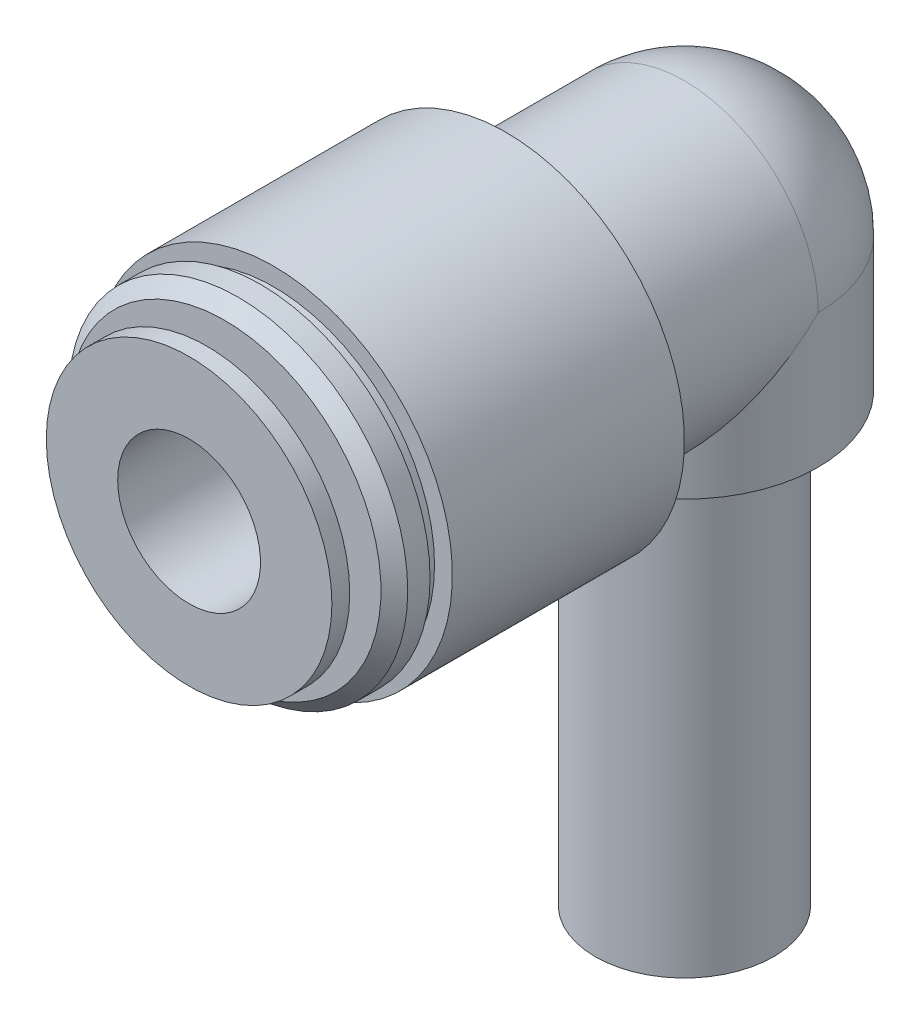
ISO-10303-21;
HEADER;
FILE_DESCRIPTION(('STEP AP214'),'2;1');
FILE_NAME('part.step','',(''),(''),'','','');
FILE_SCHEMA(('AUTOMOTIVE_DESIGN { 1 0 10303 214 1 1 1 1 }'));
ENDSEC;
DATA;
#1=APPLICATION_CONTEXT('core data for automotive mechanical design processes');
#2=APPLICATION_PROTOCOL_DEFINITION('international standard','automotive_design',2000,#1);
#3=PRODUCT_CONTEXT('',#1,'mechanical');
#4=PRODUCT('Part','Part','',(#3));
#5=PRODUCT_RELATED_PRODUCT_CATEGORY('part','',(#4));
#6=PRODUCT_DEFINITION_FORMATION('','',#4);
#7=PRODUCT_DEFINITION_CONTEXT('part definition',#1,'design');
#8=PRODUCT_DEFINITION('design','',#6,#7);
#9=PRODUCT_DEFINITION_SHAPE('','',#8);
#10=(LENGTH_UNIT() NAMED_UNIT(*) SI_UNIT(.MILLI.,.METRE.));
#11=(NAMED_UNIT(*) PLANE_ANGLE_UNIT() SI_UNIT($,.RADIAN.));
#12=(NAMED_UNIT(*) SI_UNIT($,.STERADIAN.) SOLID_ANGLE_UNIT());
#13=UNCERTAINTY_MEASURE_WITH_UNIT(LENGTH_MEASURE(1.E-05),#10,'distance_accuracy_value','');
#14=(GEOMETRIC_REPRESENTATION_CONTEXT(3) GLOBAL_UNCERTAINTY_ASSIGNED_CONTEXT((#13)) GLOBAL_UNIT_ASSIGNED_CONTEXT((#10,
#11,#12)) REPRESENTATION_CONTEXT('',''));
#15=CARTESIAN_POINT('',(0.,0.,0.));
#16=DIRECTION('',(0.,0.,1.));
#17=DIRECTION('',(1.,0.,0.));
#18=AXIS2_PLACEMENT_3D('',#15,#16,#17);
#19=CARTESIAN_POINT('',(0.,25.,0.));
#20=DIRECTION('',(0.,-1.,0.));
#21=DIRECTION('',(0.,0.,-1.));
#22=AXIS2_PLACEMENT_3D('',#19,#20,#21);
#23=CYLINDRICAL_SURFACE('',#22,7.5);
#24=CARTESIAN_POINT('',(0.,32.5,0.));
#25=DIRECTION('',(0.,-1.,0.));
#26=DIRECTION('',(0.,0.,-1.));
#27=AXIS2_PLACEMENT_3D('',#24,#25,#26);
#28=CIRCLE('',#27,7.5);
#29=CARTESIAN_POINT('',(-7.5,32.5,0.));
#30=VERTEX_POINT('',#29);
#31=CARTESIAN_POINT('',(7.5,32.5,0.));
#32=VERTEX_POINT('',#31);
#33=EDGE_CURVE('E68',#30,#32,#28,.T.);
#34=ORIENTED_EDGE('',*,*,#33,.T.);
#35=CARTESIAN_POINT('',(0.,32.5,0.));
#36=DIRECTION('',(0.,-0.707106781186547,-0.707106781186547));
#37=DIRECTION('',(0.,-0.707106781186547,0.707106781186547));
#38=AXIS2_PLACEMENT_3D('',#35,#36,#37);
#39=ELLIPSE('',#38,10.6066017177982,7.5);
#40=CARTESIAN_POINT('',(0.,25.,7.5));
#41=VERTEX_POINT('',#40);
#42=EDGE_CURVE('E51',#32,#41,#39,.T.);
#43=ORIENTED_EDGE('',*,*,#42,.T.);
#44=CARTESIAN_POINT('',(0.,25.,0.));
#45=DIRECTION('',(0.,-1.,0.));
#46=DIRECTION('',(0.,0.,-1.));
#47=AXIS2_PLACEMENT_3D('',#44,#45,#46);
#48=CIRCLE('',#47,7.5);
#49=EDGE_CURVE('E70',#41,#41,#48,.T.);
#50=ORIENTED_EDGE('',*,*,#49,.F.);
#51=EDGE_CURVE('E55',#41,#30,#39,.T.);
#52=ORIENTED_EDGE('',*,*,#51,.T.);
#53=EDGE_LOOP('',(#34,#43,#50,#52));
#54=FACE_BOUND('',#53,.T.);
#55=ADVANCED_FACE('F36',(#54),#23,.T.);
#56=CARTESIAN_POINT('',(0.,32.5,0.));
#57=DIRECTION('',(0.,-1.,0.));
#58=DIRECTION('',(1.,0.,0.));
#59=AXIS2_PLACEMENT_3D('',#56,#57,#58);
#60=SPHERICAL_SURFACE('',#59,7.5);
#61=ORIENTED_EDGE('',*,*,#33,.F.);
#62=CARTESIAN_POINT('',(0.,32.5,0.));
#63=DIRECTION('',(0.,0.,1.));
#64=DIRECTION('',(1.,0.,0.));
#65=AXIS2_PLACEMENT_3D('',#62,#63,#64);
#66=CIRCLE('',#65,7.5);
#67=EDGE_CURVE('E57',#32,#30,#66,.T.);
#68=ORIENTED_EDGE('',*,*,#67,.F.);
#69=EDGE_LOOP('',(#61,#68));
#70=FACE_BOUND('',#69,.T.);
#71=ADVANCED_FACE('F72',(#70),#60,.T.);
#72=CARTESIAN_POINT('',(0.,0.,0.));
#73=DIRECTION('',(0.,1.,0.));
#74=DIRECTION('',(0.,0.,1.));
#75=AXIS2_PLACEMENT_3D('',#72,#73,#74);
#76=PLANE('',#75);
#77=CARTESIAN_POINT('',(0.,0.,0.));
#78=DIRECTION('',(0.,1.,0.));
#79=DIRECTION('',(0.,0.,1.));
#80=AXIS2_PLACEMENT_3D('',#77,#78,#79);
#81=CIRCLE('',#80,5.);
#82=CARTESIAN_POINT('',(0.,0.,5.));
#83=VERTEX_POINT('',#82);
#84=EDGE_CURVE('E40',#83,#83,#81,.T.);
#85=ORIENTED_EDGE('',*,*,#84,.F.);
#86=EDGE_LOOP('',(#85));
#87=FACE_BOUND('',#86,.T.);
#88=CARTESIAN_POINT('',(0.,0.,0.));
#89=DIRECTION('',(0.,1.,0.));
#90=DIRECTION('',(0.,0.,1.));
#91=AXIS2_PLACEMENT_3D('',#88,#89,#90);
#92=CIRCLE('',#91,4.);
#93=CARTESIAN_POINT('',(0.,0.,4.));
#94=VERTEX_POINT('',#93);
#95=EDGE_CURVE('E79',#94,#94,#92,.T.);
#96=ORIENTED_EDGE('',*,*,#95,.T.);
#97=EDGE_LOOP('',(#96));
#98=FACE_BOUND('',#97,.T.);
#99=ADVANCED_FACE('F87',(#87,#98),#76,.F.);
#100=CARTESIAN_POINT('',(0.,25.,0.));
#101=DIRECTION('',(0.,-1.,0.));
#102=DIRECTION('',(0.,0.,-1.));
#103=AXIS2_PLACEMENT_3D('',#100,#101,#102);
#104=CYLINDRICAL_SURFACE('',#103,5.);
#105=CARTESIAN_POINT('',(0.,25.,0.));
#106=DIRECTION('',(0.,1.,0.));
#107=DIRECTION('',(0.,0.,1.));
#108=AXIS2_PLACEMENT_3D('',#105,#106,#107);
#109=CIRCLE('',#108,5.);
#110=CARTESIAN_POINT('',(0.,25.,5.));
#111=VERTEX_POINT('',#110);
#112=EDGE_CURVE('E11',#111,#111,#109,.T.);
#113=ORIENTED_EDGE('',*,*,#112,.F.);
#114=EDGE_LOOP('',(#113));
#115=FACE_BOUND('',#114,.T.);
#116=ORIENTED_EDGE('',*,*,#84,.T.);
#117=EDGE_LOOP('',(#116));
#118=FACE_BOUND('',#117,.T.);
#119=ADVANCED_FACE('F38',(#115,#118),#104,.T.);
#120=CARTESIAN_POINT('',(0.,25.,0.));
#121=DIRECTION('',(0.,-1.,0.));
#122=DIRECTION('',(0.,0.,-1.));
#123=AXIS2_PLACEMENT_3D('',#120,#121,#122);
#124=CYLINDRICAL_SURFACE('',#123,4.);
#125=CARTESIAN_POINT('',(0.,25.,0.));
#126=DIRECTION('',(0.,1.,0.));
#127=DIRECTION('',(0.,0.,1.));
#128=AXIS2_PLACEMENT_3D('',#125,#126,#127);
#129=CIRCLE('',#128,4.);
#130=CARTESIAN_POINT('',(0.,25.,4.));
#131=VERTEX_POINT('',#130);
#132=EDGE_CURVE('E74',#131,#131,#129,.T.);
#133=ORIENTED_EDGE('',*,*,#132,.T.);
#134=EDGE_LOOP('',(#133));
#135=FACE_BOUND('',#134,.T.);
#136=ORIENTED_EDGE('',*,*,#95,.F.);
#137=EDGE_LOOP('',(#136));
#138=FACE_BOUND('',#137,.T.);
#139=ADVANCED_FACE('F93',(#135,#138),#124,.F.);
#140=CARTESIAN_POINT('',(0.,25.,0.));
#141=DIRECTION('',(0.,-1.,0.));
#142=DIRECTION('',(0.,0.,-1.));
#143=AXIS2_PLACEMENT_3D('',#140,#141,#142);
#144=PLANE('',#143);
#145=ORIENTED_EDGE('',*,*,#132,.F.);
#146=EDGE_LOOP('',(#145));
#147=FACE_BOUND('',#146,.T.);
#148=ADVANCED_FACE('F105',(#147),#144,.T.);
#149=ORIENTED_EDGE('',*,*,#49,.T.);
#150=EDGE_LOOP('',(#149));
#151=FACE_BOUND('',#150,.T.);
#152=ORIENTED_EDGE('',*,*,#112,.T.);
#153=EDGE_LOOP('',(#152));
#154=FACE_BOUND('',#153,.T.);
#155=ADVANCED_FACE('F103',(#151,#154),#144,.T.);
#156=CARTESIAN_POINT('',(0.,32.5,10.));
#157=DIRECTION('',(0.,0.,-1.));
#158=DIRECTION('',(-1.,0.,0.));
#159=AXIS2_PLACEMENT_3D('',#156,#157,#158);
#160=CYLINDRICAL_SURFACE('',#159,7.5);
#161=ORIENTED_EDGE('',*,*,#42,.F.);
#162=ORIENTED_EDGE('',*,*,#67,.T.);
#163=ORIENTED_EDGE('',*,*,#51,.F.);
#164=EDGE_LOOP('',(#161,#162,#163));
#165=FACE_BOUND('',#164,.T.);
#166=CARTESIAN_POINT('',(0.,32.5,10.));
#167=DIRECTION('',(0.,0.,1.));
#168=DIRECTION('',(1.,0.,0.));
#169=AXIS2_PLACEMENT_3D('',#166,#167,#168);
#170=CIRCLE('',#169,7.5);
#171=CARTESIAN_POINT('',(7.5,32.5,10.));
#172=VERTEX_POINT('',#171);
#173=EDGE_CURVE('E63',#172,#172,#170,.T.);
#174=ORIENTED_EDGE('',*,*,#173,.F.);
#175=EDGE_LOOP('',(#174));
#176=FACE_BOUND('',#175,.T.);
#177=ADVANCED_FACE('F58',(#165,#176),#160,.T.);
#178=CARTESIAN_POINT('',(0.,32.5,23.));
#179=DIRECTION('',(0.,0.,-1.));
#180=DIRECTION('',(-1.,0.,0.));
#181=AXIS2_PLACEMENT_3D('',#178,#179,#180);
#182=CYLINDRICAL_SURFACE('',#181,10.);
#183=CARTESIAN_POINT('',(0.,32.5,23.));
#184=DIRECTION('',(0.,0.,1.));
#185=DIRECTION('',(1.,0.,0.));
#186=AXIS2_PLACEMENT_3D('',#183,#184,#185);
#187=CIRCLE('',#186,10.);
#188=CARTESIAN_POINT('',(-10.,32.5,23.));
#189=VERTEX_POINT('',#188);
#190=EDGE_CURVE('E64',#189,#189,#187,.T.);
#191=CARTESIAN_POINT('',(0.,32.5,10.));
#192=DIRECTION('',(0.,0.,1.));
#193=DIRECTION('',(1.,0.,0.));
#194=AXIS2_PLACEMENT_3D('',#191,#192,#193);
#195=CIRCLE('',#194,10.);
#196=CARTESIAN_POINT('',(-10.,32.5,10.));
#197=VERTEX_POINT('',#196);
#198=EDGE_CURVE('E345',#197,#197,#195,.T.);
#199=CARTESIAN_POINT('',(-10.,32.5,23.));
#200=CARTESIAN_POINT('',(-10.,32.5,22.8645833333333));
#201=CARTESIAN_POINT('',(-10.,32.5,22.7291666666667));
#202=CARTESIAN_POINT('',(-10.,32.5,22.4583333333333));
#203=CARTESIAN_POINT('',(-10.,32.5,22.3229166666667));
#204=CARTESIAN_POINT('',(-10.,32.5,22.0520833333333));
#205=CARTESIAN_POINT('',(-10.,32.5,21.9166666666667));
#206=CARTESIAN_POINT('',(-10.,32.5,21.6458333333333));
#207=CARTESIAN_POINT('',(-10.,32.5,21.5104166666667));
#208=CARTESIAN_POINT('',(-10.,32.5,21.2395833333333));
#209=CARTESIAN_POINT('',(-10.,32.5,21.1041666666667));
#210=CARTESIAN_POINT('',(-10.,32.5,20.8333333333333));
#211=CARTESIAN_POINT('',(-10.,32.5,20.6979166666667));
#212=CARTESIAN_POINT('',(-10.,32.5,20.4270833333333));
#213=CARTESIAN_POINT('',(-10.,32.5,20.2916666666667));
#214=CARTESIAN_POINT('',(-10.,32.5,20.0208333333333));
#215=CARTESIAN_POINT('',(-10.,32.5,19.8854166666667));
#216=CARTESIAN_POINT('',(-10.,32.5,19.6145833333333));
#217=CARTESIAN_POINT('',(-10.,32.5,19.4791666666667));
#218=CARTESIAN_POINT('',(-10.,32.5,19.2083333333333));
#219=CARTESIAN_POINT('',(-10.,32.5,19.0729166666667));
#220=CARTESIAN_POINT('',(-10.,32.5,18.8020833333333));
#221=CARTESIAN_POINT('',(-10.,32.5,18.6666666666667));
#222=CARTESIAN_POINT('',(-10.,32.5,18.3958333333333));
#223=CARTESIAN_POINT('',(-10.,32.5,18.2604166666667));
#224=CARTESIAN_POINT('',(-10.,32.5,17.9895833333333));
#225=CARTESIAN_POINT('',(-10.,32.5,17.8541666666667));
#226=CARTESIAN_POINT('',(-10.,32.5,17.5833333333333));
#227=CARTESIAN_POINT('',(-10.,32.5,17.4479166666667));
#228=CARTESIAN_POINT('',(-10.,32.5,17.1770833333333));
#229=CARTESIAN_POINT('',(-10.,32.5,17.0416666666667));
#230=CARTESIAN_POINT('',(-10.,32.5,16.7708333333333));
#231=CARTESIAN_POINT('',(-10.,32.5,16.6354166666667));
#232=CARTESIAN_POINT('',(-10.,32.5,16.3645833333333));
#233=CARTESIAN_POINT('',(-10.,32.5,16.2291666666667));
#234=CARTESIAN_POINT('',(-10.,32.5,15.9583333333333));
#235=CARTESIAN_POINT('',(-10.,32.5,15.8229166666667));
#236=CARTESIAN_POINT('',(-10.,32.5,15.5520833333333));
#237=CARTESIAN_POINT('',(-10.,32.5,15.4166666666667));
#238=CARTESIAN_POINT('',(-10.,32.5,15.1458333333333));
#239=CARTESIAN_POINT('',(-10.,32.5,15.0104166666667));
#240=CARTESIAN_POINT('',(-10.,32.5,14.7395833333333));
#241=CARTESIAN_POINT('',(-10.,32.5,14.6041666666667));
#242=CARTESIAN_POINT('',(-10.,32.5,14.3333333333333));
#243=CARTESIAN_POINT('',(-10.,32.5,14.1979166666667));
#244=CARTESIAN_POINT('',(-10.,32.5,13.9270833333333));
#245=CARTESIAN_POINT('',(-10.,32.5,13.7916666666667));
#246=CARTESIAN_POINT('',(-10.,32.5,13.5208333333333));
#247=CARTESIAN_POINT('',(-10.,32.5,13.3854166666667));
#248=CARTESIAN_POINT('',(-10.,32.5,13.1145833333333));
#249=CARTESIAN_POINT('',(-10.,32.5,12.9791666666667));
#250=CARTESIAN_POINT('',(-10.,32.5,12.7083333333333));
#251=CARTESIAN_POINT('',(-10.,32.5,12.5729166666667));
#252=CARTESIAN_POINT('',(-10.,32.5,12.3020833333333));
#253=CARTESIAN_POINT('',(-10.,32.5,12.1666666666667));
#254=CARTESIAN_POINT('',(-10.,32.5,11.8958333333333));
#255=CARTESIAN_POINT('',(-10.,32.5,11.7604166666667));
#256=CARTESIAN_POINT('',(-10.,32.5,11.4895833333333));
#257=CARTESIAN_POINT('',(-10.,32.5,11.3541666666667));
#258=CARTESIAN_POINT('',(-10.,32.5,11.0833333333333));
#259=CARTESIAN_POINT('',(-10.,32.5,10.9479166666667));
#260=CARTESIAN_POINT('',(-10.,32.5,10.6770833333333));
#261=CARTESIAN_POINT('',(-10.,32.5,10.5416666666667));
#262=CARTESIAN_POINT('',(-10.,32.5,10.2708333333333));
#263=CARTESIAN_POINT('',(-10.,32.5,10.1354166666667));
#264=CARTESIAN_POINT('',(-10.,32.5,10.));
#265=B_SPLINE_CURVE_WITH_KNOTS('',3,(#199,#200,#201,#202,#203,#204,#205,#206,#207,#208,#209,
#210,#211,#212,#213,#214,#215,#216,#217,#218,#219,#220,#221,#222,#223,#224,#225,#226,#227,#228,
#229,#230,#231,#232,#233,#234,#235,#236,#237,#238,#239,#240,#241,#242,#243,#244,#245,#246,#247,
#248,#249,#250,#251,#252,#253,#254,#255,#256,#257,#258,#259,#260,#261,#262,#263,#264),
.UNSPECIFIED.,.F.,.F.,(4,2,2,2,2,2,2,2,2,2,2,2,2,2,2,2,2,2,2,2,2,2,2,2,2,2,2,2,2,2,2,2,4),(0.,
0.406249999999997,0.812499999999997,1.21875,1.625,2.03125,2.4375,2.84375,3.25,3.65625,4.0625,
4.46875,4.875,5.28125,5.6875,6.09375,6.5,6.90625,7.3125,7.71875,8.125,8.53124999999999,8.9375,
9.34375,9.75,10.15625,10.5625,10.96875,11.375,11.78125,12.1875,12.59375,13.),.UNSPECIFIED.);
#266=EDGE_CURVE('BSEAM127',#189,#197,#265,.T.);
#267=ORIENTED_EDGE('',*,*,#190,.F.);
#268=ORIENTED_EDGE('',*,*,#198,.T.);
#269=ORIENTED_EDGE('',*,*,#266,.T.);
#270=ORIENTED_EDGE('',*,*,#266,.F.);
#271=EDGE_LOOP('',(#267,#269,#268,#270));
#272=FACE_BOUND('',#271,.T.);
#273=ADVANCED_FACE('F127',(#272),#182,.T.);
#274=CARTESIAN_POINT('',(0.,32.5,23.));
#275=DIRECTION('',(0.,0.,1.));
#276=DIRECTION('',(1.,0.,0.));
#277=AXIS2_PLACEMENT_3D('',#274,#275,#276);
#278=PLANE('',#277);
#279=CARTESIAN_POINT('',(0.,32.5,23.));
#280=DIRECTION('',(0.,0.,-1.));
#281=DIRECTION('',(-1.,0.,0.));
#282=AXIS2_PLACEMENT_3D('',#279,#280,#281);
#283=CIRCLE('',#282,8.99999999999996);
#284=CARTESIAN_POINT('',(-8.99999999999996,32.5,23.));
#285=VERTEX_POINT('',#284);
#286=EDGE_CURVE('E313',#285,#285,#283,.T.);
#287=ORIENTED_EDGE('',*,*,#286,.T.);
#288=EDGE_LOOP('',(#287));
#289=FACE_BOUND('',#288,.T.);
#290=ORIENTED_EDGE('',*,*,#190,.T.);
#291=EDGE_LOOP('',(#290));
#292=FACE_BOUND('',#291,.T.);
#293=ADVANCED_FACE('F133',(#289,#292),#278,.T.);
#294=CARTESIAN_POINT('',(0.,32.5,10.));
#295=DIRECTION('',(0.,0.,1.));
#296=DIRECTION('',(1.,0.,0.));
#297=AXIS2_PLACEMENT_3D('',#294,#295,#296);
#298=PLANE('',#297);
#299=ORIENTED_EDGE('',*,*,#173,.T.);
#300=EDGE_LOOP('',(#299));
#301=FACE_BOUND('',#300,.T.);
#302=ORIENTED_EDGE('',*,*,#198,.F.);
#303=EDGE_LOOP('',(#302));
#304=FACE_BOUND('',#303,.T.);
#305=ADVANCED_FACE('F142',(#301,#304),#298,.F.);
#306=CARTESIAN_POINT('',(0.,32.5,23.));
#307=DIRECTION('',(0.,0.,-1.));
#308=DIRECTION('',(-1.,0.,0.));
#309=AXIS2_PLACEMENT_3D('',#306,#307,#308);
#310=CYLINDRICAL_SURFACE('',#309,4.);
#311=CARTESIAN_POINT('',(0.,32.5,27.75));
#312=DIRECTION('',(0.,0.,-1.));
#313=DIRECTION('',(-1.,0.,0.));
#314=AXIS2_PLACEMENT_3D('',#311,#312,#313);
#315=CIRCLE('',#314,4.);
#316=CARTESIAN_POINT('',(-4.,32.5,27.75));
#317=VERTEX_POINT('',#316);
#318=EDGE_CURVE('E342',#317,#317,#315,.T.);
#319=ORIENTED_EDGE('',*,*,#318,.F.);
#320=EDGE_LOOP('',(#319));
#321=FACE_BOUND('',#320,.T.);
#322=CARTESIAN_POINT('',(0.,32.5,-0.249999999999979));
#323=DIRECTION('',(0.,0.,1.));
#324=DIRECTION('',(1.,0.,0.));
#325=AXIS2_PLACEMENT_3D('',#322,#323,#324);
#326=CIRCLE('',#325,4.);
#327=CARTESIAN_POINT('',(4.,32.5,-0.249999999999979));
#328=VERTEX_POINT('',#327);
#329=EDGE_CURVE('E311',#328,#328,#326,.T.);
#330=ORIENTED_EDGE('',*,*,#329,.F.);
#331=EDGE_LOOP('',(#330));
#332=FACE_BOUND('',#331,.T.);
#333=ADVANCED_FACE('F150',(#321,#332),#310,.F.);
#334=CARTESIAN_POINT('',(0.,28.5,27.75));
#335=DIRECTION('',(0.,0.,-1.));
#336=DIRECTION('',(-1.,0.,0.));
#337=AXIS2_PLACEMENT_3D('',#334,#335,#336);
#338=PLANE('',#337);
#339=CARTESIAN_POINT('',(0.,32.5,27.75));
#340=DIRECTION('',(0.,0.,-1.));
#341=DIRECTION('',(-1.,0.,0.));
#342=AXIS2_PLACEMENT_3D('',#339,#340,#341);
#343=CIRCLE('',#342,8.);
#344=CARTESIAN_POINT('',(-8.,32.5,27.75));
#345=VERTEX_POINT('',#344);
#346=EDGE_CURVE('E339',#345,#345,#343,.T.);
#347=ORIENTED_EDGE('',*,*,#346,.F.);
#348=EDGE_LOOP('',(#347));
#349=FACE_BOUND('',#348,.T.);
#350=ORIENTED_EDGE('',*,*,#318,.T.);
#351=EDGE_LOOP('',(#350));
#352=FACE_BOUND('',#351,.T.);
#353=ADVANCED_FACE('F158',(#349,#352),#338,.F.);
#354=CARTESIAN_POINT('',(0.,32.5,23.));
#355=DIRECTION('',(0.,0.,-1.));
#356=DIRECTION('',(-1.,0.,0.));
#357=AXIS2_PLACEMENT_3D('',#354,#355,#356);
#358=CYLINDRICAL_SURFACE('',#357,8.);
#359=CARTESIAN_POINT('',(0.,32.5,26.7499999999999));
#360=DIRECTION('',(0.,0.,-1.));
#361=DIRECTION('',(-1.,0.,0.));
#362=AXIS2_PLACEMENT_3D('',#359,#360,#361);
#363=CIRCLE('',#362,8.);
#364=CARTESIAN_POINT('',(-8.,32.5,26.7499999999999));
#365=VERTEX_POINT('',#364);
#366=EDGE_CURVE('E336',#365,#365,#363,.T.);
#367=ORIENTED_EDGE('',*,*,#366,.F.);
#368=EDGE_LOOP('',(#367));
#369=FACE_BOUND('',#368,.T.);
#370=ORIENTED_EDGE('',*,*,#346,.T.);
#371=EDGE_LOOP('',(#370));
#372=FACE_BOUND('',#371,.T.);
#373=ADVANCED_FACE('F166',(#369,#372),#358,.T.);
#374=CARTESIAN_POINT('',(0.,24.5,26.7499999999999));
#375=DIRECTION('',(0.,0.,1.));
#376=DIRECTION('',(1.,0.,0.));
#377=AXIS2_PLACEMENT_3D('',#374,#375,#376);
#378=PLANE('',#377);
#379=CARTESIAN_POINT('',(0.,32.5,26.7499999999999));
#380=DIRECTION('',(0.,0.,-1.));
#381=DIRECTION('',(-1.,0.,0.));
#382=AXIS2_PLACEMENT_3D('',#379,#380,#381);
#383=CIRCLE('',#382,5.99999999999998);
#384=CARTESIAN_POINT('',(-5.99999999999998,32.5,26.7499999999999));
#385=VERTEX_POINT('',#384);
#386=EDGE_CURVE('E333',#385,#385,#383,.T.);
#387=ORIENTED_EDGE('',*,*,#386,.F.);
#388=EDGE_LOOP('',(#387));
#389=FACE_BOUND('',#388,.T.);
#390=ORIENTED_EDGE('',*,*,#366,.T.);
#391=EDGE_LOOP('',(#390));
#392=FACE_BOUND('',#391,.T.);
#393=ADVANCED_FACE('F173',(#389,#392),#378,.F.);
#394=CARTESIAN_POINT('',(0.,32.5,23.));
#395=DIRECTION('',(0.,0.,-1.));
#396=DIRECTION('',(-1.,0.,0.));
#397=AXIS2_PLACEMENT_3D('',#394,#395,#396);
#398=CYLINDRICAL_SURFACE('',#397,5.99999999999998);
#399=CARTESIAN_POINT('',(0.,32.5,25.75));
#400=DIRECTION('',(0.,0.,-1.));
#401=DIRECTION('',(-1.,0.,0.));
#402=AXIS2_PLACEMENT_3D('',#399,#400,#401);
#403=CIRCLE('',#402,5.99999999999998);
#404=CARTESIAN_POINT('',(-5.99999999999998,32.5,25.75));
#405=VERTEX_POINT('',#404);
#406=EDGE_CURVE('E330',#405,#405,#403,.T.);
#407=ORIENTED_EDGE('',*,*,#406,.F.);
#408=EDGE_LOOP('',(#407));
#409=FACE_BOUND('',#408,.T.);
#410=ORIENTED_EDGE('',*,*,#386,.T.);
#411=EDGE_LOOP('',(#410));
#412=FACE_BOUND('',#411,.T.);
#413=ADVANCED_FACE('F182',(#409,#412),#398,.T.);
#414=CARTESIAN_POINT('',(0.,26.5,25.75));
#415=DIRECTION('',(0.,0.,-1.));
#416=DIRECTION('',(-1.,0.,0.));
#417=AXIS2_PLACEMENT_3D('',#414,#415,#416);
#418=PLANE('',#417);
#419=CARTESIAN_POINT('',(0.,32.5,25.75));
#420=DIRECTION('',(0.,0.,-1.));
#421=DIRECTION('',(-1.,0.,0.));
#422=AXIS2_PLACEMENT_3D('',#419,#420,#421);
#423=CIRCLE('',#422,8.74999999999998);
#424=CARTESIAN_POINT('',(-8.74999999999998,32.5,25.75));
#425=VERTEX_POINT('',#424);
#426=EDGE_CURVE('E327',#425,#425,#423,.T.);
#427=ORIENTED_EDGE('',*,*,#426,.F.);
#428=EDGE_LOOP('',(#427));
#429=FACE_BOUND('',#428,.T.);
#430=ORIENTED_EDGE('',*,*,#406,.T.);
#431=EDGE_LOOP('',(#430));
#432=FACE_BOUND('',#431,.T.);
#433=ADVANCED_FACE('F190',(#429,#432),#418,.F.);
#434=CARTESIAN_POINT('',(0.,32.5,25.75));
#435=DIRECTION('',(0.,0.,-1.));
#436=DIRECTION('',(-1.,0.,0.));
#437=AXIS2_PLACEMENT_3D('',#434,#435,#436);
#438=CONICAL_SURFACE('',#437,8.74999999999998,0.785398163397448);
#439=CARTESIAN_POINT('',(0.,32.5,25.));
#440=DIRECTION('',(0.,0.,-1.));
#441=DIRECTION('',(-1.,0.,0.));
#442=AXIS2_PLACEMENT_3D('',#439,#440,#441);
#443=CIRCLE('',#442,9.49999999999998);
#444=CARTESIAN_POINT('',(-9.49999999999998,32.5,25.));
#445=VERTEX_POINT('',#444);
#446=EDGE_CURVE('E324',#445,#445,#443,.T.);
#447=ORIENTED_EDGE('',*,*,#446,.F.);
#448=EDGE_LOOP('',(#447));
#449=FACE_BOUND('',#448,.T.);
#450=ORIENTED_EDGE('',*,*,#426,.T.);
#451=EDGE_LOOP('',(#450));
#452=FACE_BOUND('',#451,.T.);
#453=ADVANCED_FACE('F197',(#449,#452),#438,.T.);
#454=CARTESIAN_POINT('',(0.,32.5,23.));
#455=DIRECTION('',(0.,0.,-1.));
#456=DIRECTION('',(-1.,0.,0.));
#457=AXIS2_PLACEMENT_3D('',#454,#455,#456);
#458=CYLINDRICAL_SURFACE('',#457,9.49999999999998);
#459=CARTESIAN_POINT('',(0.,32.5,23.75));
#460=DIRECTION('',(0.,0.,-1.));
#461=DIRECTION('',(-1.,0.,0.));
#462=AXIS2_PLACEMENT_3D('',#459,#460,#461);
#463=CIRCLE('',#462,9.49999999999998);
#464=CARTESIAN_POINT('',(-9.49999999999998,32.5,23.75));
#465=VERTEX_POINT('',#464);
#466=EDGE_CURVE('E321',#465,#465,#463,.T.);
#467=ORIENTED_EDGE('',*,*,#466,.F.);
#468=EDGE_LOOP('',(#467));
#469=FACE_BOUND('',#468,.T.);
#470=ORIENTED_EDGE('',*,*,#446,.T.);
#471=EDGE_LOOP('',(#470));
#472=FACE_BOUND('',#471,.T.);
#473=ADVANCED_FACE('F205',(#469,#472),#458,.T.);
#474=CARTESIAN_POINT('',(0.,23.,23.75));
#475=DIRECTION('',(0.,0.,1.));
#476=DIRECTION('',(1.,0.,0.));
#477=AXIS2_PLACEMENT_3D('',#474,#475,#476);
#478=PLANE('',#477);
#479=CARTESIAN_POINT('',(0.,32.5,23.75));
#480=DIRECTION('',(0.,0.,-1.));
#481=DIRECTION('',(-1.,0.,0.));
#482=AXIS2_PLACEMENT_3D('',#479,#480,#481);
#483=CIRCLE('',#482,8.99999999999996);
#484=CARTESIAN_POINT('',(-8.99999999999996,32.5,23.75));
#485=VERTEX_POINT('',#484);
#486=EDGE_CURVE('E316',#485,#485,#483,.T.);
#487=ORIENTED_EDGE('',*,*,#486,.F.);
#488=EDGE_LOOP('',(#487));
#489=FACE_BOUND('',#488,.T.);
#490=ORIENTED_EDGE('',*,*,#466,.T.);
#491=EDGE_LOOP('',(#490));
#492=FACE_BOUND('',#491,.T.);
#493=ADVANCED_FACE('F213',(#489,#492),#478,.F.);
#494=CARTESIAN_POINT('',(0.,32.5,23.));
#495=DIRECTION('',(0.,0.,-1.));
#496=DIRECTION('',(-1.,0.,0.));
#497=AXIS2_PLACEMENT_3D('',#494,#495,#496);
#498=CYLINDRICAL_SURFACE('',#497,8.99999999999996);
#499=ORIENTED_EDGE('',*,*,#286,.F.);
#500=EDGE_LOOP('',(#499));
#501=FACE_BOUND('',#500,.T.);
#502=ORIENTED_EDGE('',*,*,#486,.T.);
#503=EDGE_LOOP('',(#502));
#504=FACE_BOUND('',#503,.T.);
#505=ADVANCED_FACE('F221',(#501,#504),#498,.T.);
#506=CARTESIAN_POINT('',(0.,32.5,-0.249999999999979));
#507=DIRECTION('',(0.,0.,1.));
#508=DIRECTION('',(1.,0.,0.));
#509=AXIS2_PLACEMENT_3D('',#506,#507,#508);
#510=PLANE('',#509);
#511=ORIENTED_EDGE('',*,*,#329,.T.);
#512=EDGE_LOOP('',(#511));
#513=FACE_BOUND('',#512,.T.);
#514=ADVANCED_FACE('F229',(#513),#510,.T.);
#515=CLOSED_SHELL('',(#55,#71,#99,#119,#139,#148,#155,#177,#273,#293,#305,#333,#353,#373,#393,
#413,#433,#453,#473,#493,#505,#514));
#516=MANIFOLD_SOLID_BREP('B2',#515);
#517=ADVANCED_BREP_SHAPE_REPRESENTATION('',(#18,#516),#14);
#518=SHAPE_DEFINITION_REPRESENTATION(#9,#517);
ENDSEC;
END-ISO-10303-21;
